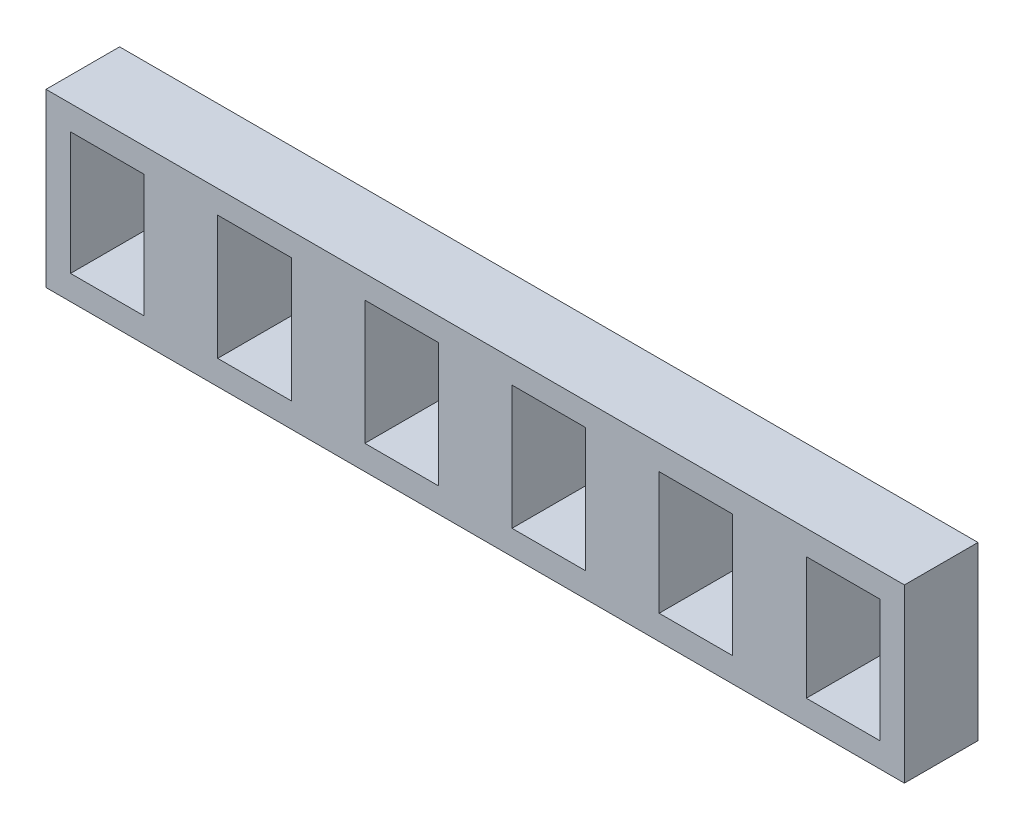
ISO-10303-21;
HEADER;
FILE_DESCRIPTION(('STEP AP214'),'2;1');
FILE_NAME('part.step','',(''),(''),'','','');
FILE_SCHEMA(('AUTOMOTIVE_DESIGN { 1 0 10303 214 1 1 1 1 }'));
ENDSEC;
DATA;
#1=APPLICATION_CONTEXT('core data for automotive mechanical design processes');
#2=APPLICATION_PROTOCOL_DEFINITION('international standard','automotive_design',2000,#1);
#3=PRODUCT_CONTEXT('',#1,'mechanical');
#4=PRODUCT('Part','Part','',(#3));
#5=PRODUCT_RELATED_PRODUCT_CATEGORY('part','',(#4));
#6=PRODUCT_DEFINITION_FORMATION('','',#4);
#7=PRODUCT_DEFINITION_CONTEXT('part definition',#1,'design');
#8=PRODUCT_DEFINITION('design','',#6,#7);
#9=PRODUCT_DEFINITION_SHAPE('','',#8);
#10=(LENGTH_UNIT() NAMED_UNIT(*) SI_UNIT(.MILLI.,.METRE.));
#11=(NAMED_UNIT(*) PLANE_ANGLE_UNIT() SI_UNIT($,.RADIAN.));
#12=(NAMED_UNIT(*) SI_UNIT($,.STERADIAN.) SOLID_ANGLE_UNIT());
#13=UNCERTAINTY_MEASURE_WITH_UNIT(LENGTH_MEASURE(1.E-05),#10,'distance_accuracy_value','');
#14=(GEOMETRIC_REPRESENTATION_CONTEXT(3) GLOBAL_UNCERTAINTY_ASSIGNED_CONTEXT((#13)) GLOBAL_UNIT_ASSIGNED_CONTEXT((#10,
#11,#12)) REPRESENTATION_CONTEXT('',''));
#15=CARTESIAN_POINT('',(0.,0.,0.));
#16=DIRECTION('',(0.,0.,1.));
#17=DIRECTION('',(1.,0.,0.));
#18=AXIS2_PLACEMENT_3D('',#15,#16,#17);
#19=CARTESIAN_POINT('',(0.,17.2786642532247,3.));
#20=DIRECTION('',(0.,1.,0.));
#21=DIRECTION('',(0.,0.,1.));
#22=AXIS2_PLACEMENT_3D('',#19,#20,#21);
#23=PLANE('',#22);
#24=DIRECTION('',(1.,0.,0.));
#25=VECTOR('',#24,1.);
#26=CARTESIAN_POINT('',(0.,17.2786642532247,0.));
#27=LINE('',#26,#25);
#28=CARTESIAN_POINT('',(-1.87785384637787,17.2786642532247,0.));
#29=VERTEX_POINT('',#28);
#30=CARTESIAN_POINT('',(1.12214615362213,17.2786642532247,0.));
#31=VERTEX_POINT('',#30);
#32=EDGE_CURVE('E361',#29,#31,#27,.T.);
#33=ORIENTED_EDGE('',*,*,#32,.T.);
#34=DIRECTION('',(0.,0.,-1.));
#35=VECTOR('',#34,1.);
#36=CARTESIAN_POINT('',(1.12214615362213,17.2786642532247,3.));
#37=LINE('',#36,#35);
#38=CARTESIAN_POINT('',(1.12214615362213,17.2786642532247,3.));
#39=VERTEX_POINT('',#38);
#40=EDGE_CURVE('E11',#39,#31,#37,.T.);
#41=ORIENTED_EDGE('',*,*,#40,.F.);
#42=DIRECTION('',(1.,0.,0.));
#43=VECTOR('',#42,1.);
#44=CARTESIAN_POINT('',(0.,17.2786642532247,3.));
#45=LINE('',#44,#43);
#46=CARTESIAN_POINT('',(-1.87785384637787,17.2786642532247,3.));
#47=VERTEX_POINT('',#46);
#48=EDGE_CURVE('E250',#47,#39,#45,.T.);
#49=ORIENTED_EDGE('',*,*,#48,.F.);
#50=DIRECTION('',(0.,0.,-1.));
#51=VECTOR('',#50,1.);
#52=CARTESIAN_POINT('',(-1.87785384637787,17.2786642532247,3.));
#53=LINE('',#52,#51);
#54=EDGE_CURVE('E70',#47,#29,#53,.T.);
#55=ORIENTED_EDGE('',*,*,#54,.T.);
#56=EDGE_LOOP('',(#33,#41,#49,#55));
#57=FACE_BOUND('',#56,.T.);
#58=ADVANCED_FACE('F50',(#57),#23,.F.);
#59=CARTESIAN_POINT('',(1.12214615362213,0.,3.));
#60=DIRECTION('',(1.,0.,0.));
#61=DIRECTION('',(0.,0.,-1.));
#62=AXIS2_PLACEMENT_3D('',#59,#60,#61);
#63=PLANE('',#62);
#64=DIRECTION('',(0.,-1.,0.));
#65=VECTOR('',#64,1.);
#66=CARTESIAN_POINT('',(1.12214615362213,0.,0.));
#67=LINE('',#66,#65);
#68=CARTESIAN_POINT('',(1.12214615362213,12.2206953629668,0.));
#69=VERTEX_POINT('',#68);
#70=EDGE_CURVE('E255',#31,#69,#67,.T.);
#71=ORIENTED_EDGE('',*,*,#70,.T.);
#72=DIRECTION('',(0.,0.,-1.));
#73=VECTOR('',#72,1.);
#74=CARTESIAN_POINT('',(1.12214615362213,12.2206953629668,3.));
#75=LINE('',#74,#73);
#76=CARTESIAN_POINT('',(1.12214615362213,12.2206953629668,3.));
#77=VERTEX_POINT('',#76);
#78=EDGE_CURVE('E59',#77,#69,#75,.T.);
#79=ORIENTED_EDGE('',*,*,#78,.F.);
#80=DIRECTION('',(0.,-1.,0.));
#81=VECTOR('',#80,1.);
#82=CARTESIAN_POINT('',(1.12214615362213,0.,3.));
#83=LINE('',#82,#81);
#84=EDGE_CURVE('E242',#39,#77,#83,.T.);
#85=ORIENTED_EDGE('',*,*,#84,.F.);
#86=ORIENTED_EDGE('',*,*,#40,.T.);
#87=EDGE_LOOP('',(#71,#79,#85,#86));
#88=FACE_BOUND('',#87,.T.);
#89=ADVANCED_FACE('F251',(#88),#63,.F.);
#90=CARTESIAN_POINT('',(0.,12.2206953629668,3.));
#91=DIRECTION('',(0.,1.,0.));
#92=DIRECTION('',(0.,0.,1.));
#93=AXIS2_PLACEMENT_3D('',#90,#91,#92);
#94=PLANE('',#93);
#95=DIRECTION('',(1.,0.,0.));
#96=VECTOR('',#95,1.);
#97=CARTESIAN_POINT('',(0.,12.2206953629668,0.));
#98=LINE('',#97,#96);
#99=CARTESIAN_POINT('',(-1.87785384637787,12.2206953629668,0.));
#100=VERTEX_POINT('',#99);
#101=EDGE_CURVE('E366',#100,#69,#98,.T.);
#102=ORIENTED_EDGE('',*,*,#101,.F.);
#103=DIRECTION('',(0.,0.,-1.));
#104=VECTOR('',#103,1.);
#105=CARTESIAN_POINT('',(-1.87785384637787,12.2206953629668,3.));
#106=LINE('',#105,#104);
#107=CARTESIAN_POINT('',(-1.87785384637787,12.2206953629668,3.));
#108=VERTEX_POINT('',#107);
#109=EDGE_CURVE('E153',#108,#100,#106,.T.);
#110=ORIENTED_EDGE('',*,*,#109,.F.);
#111=DIRECTION('',(1.,0.,0.));
#112=VECTOR('',#111,1.);
#113=CARTESIAN_POINT('',(0.,12.2206953629668,3.));
#114=LINE('',#113,#112);
#115=EDGE_CURVE('E247',#108,#77,#114,.T.);
#116=ORIENTED_EDGE('',*,*,#115,.T.);
#117=ORIENTED_EDGE('',*,*,#78,.T.);
#118=EDGE_LOOP('',(#102,#110,#116,#117));
#119=FACE_BOUND('',#118,.T.);
#120=ADVANCED_FACE('F259',(#119),#94,.T.);
#121=CARTESIAN_POINT('',(0.,17.2786642532247,3.));
#122=DIRECTION('',(0.,1.,0.));
#123=DIRECTION('',(0.,0.,1.));
#124=AXIS2_PLACEMENT_3D('',#121,#122,#123);
#125=PLANE('',#124);
#126=DIRECTION('',(1.,0.,0.));
#127=VECTOR('',#126,1.);
#128=CARTESIAN_POINT('',(0.,17.2786642532247,0.));
#129=LINE('',#128,#127);
#130=CARTESIAN_POINT('',(-7.87785384637787,17.2786642532247,0.));
#131=VERTEX_POINT('',#130);
#132=CARTESIAN_POINT('',(-4.87785384637787,17.2786642532247,0.));
#133=VERTEX_POINT('',#132);
#134=EDGE_CURVE('E350',#131,#133,#129,.T.);
#135=ORIENTED_EDGE('',*,*,#134,.T.);
#136=DIRECTION('',(0.,0.,-1.));
#137=VECTOR('',#136,1.);
#138=CARTESIAN_POINT('',(-4.87785384637787,17.2786642532247,3.));
#139=LINE('',#138,#137);
#140=CARTESIAN_POINT('',(-4.87785384637787,17.2786642532247,3.));
#141=VERTEX_POINT('',#140);
#142=EDGE_CURVE('E378',#141,#133,#139,.T.);
#143=ORIENTED_EDGE('',*,*,#142,.F.);
#144=DIRECTION('',(1.,0.,0.));
#145=VECTOR('',#144,1.);
#146=CARTESIAN_POINT('',(0.,17.2786642532247,3.));
#147=LINE('',#146,#145);
#148=CARTESIAN_POINT('',(-7.87785384637787,17.2786642532247,3.));
#149=VERTEX_POINT('',#148);
#150=EDGE_CURVE('E541',#149,#141,#147,.T.);
#151=ORIENTED_EDGE('',*,*,#150,.F.);
#152=DIRECTION('',(0.,0.,-1.));
#153=VECTOR('',#152,1.);
#154=CARTESIAN_POINT('',(-7.87785384637787,17.2786642532247,3.));
#155=LINE('',#154,#153);
#156=EDGE_CURVE('E381',#149,#131,#155,.T.);
#157=ORIENTED_EDGE('',*,*,#156,.T.);
#158=EDGE_LOOP('',(#135,#143,#151,#157));
#159=FACE_BOUND('',#158,.T.);
#160=ADVANCED_FACE('F575',(#159),#125,.F.);
#161=CARTESIAN_POINT('',(-4.87785384637787,0.,3.));
#162=DIRECTION('',(1.,0.,0.));
#163=DIRECTION('',(0.,0.,-1.));
#164=AXIS2_PLACEMENT_3D('',#161,#162,#163);
#165=PLANE('',#164);
#166=DIRECTION('',(0.,-1.,0.));
#167=VECTOR('',#166,1.);
#168=CARTESIAN_POINT('',(-4.87785384637787,0.,0.));
#169=LINE('',#168,#167);
#170=CARTESIAN_POINT('',(-4.87785384637787,12.2206953629668,0.));
#171=VERTEX_POINT('',#170);
#172=EDGE_CURVE('E352',#133,#171,#169,.T.);
#173=ORIENTED_EDGE('',*,*,#172,.T.);
#174=DIRECTION('',(0.,0.,-1.));
#175=VECTOR('',#174,1.);
#176=CARTESIAN_POINT('',(-4.87785384637787,12.2206953629668,3.));
#177=LINE('',#176,#175);
#178=CARTESIAN_POINT('',(-4.87785384637787,12.2206953629668,3.));
#179=VERTEX_POINT('',#178);
#180=EDGE_CURVE('E389',#179,#171,#177,.T.);
#181=ORIENTED_EDGE('',*,*,#180,.F.);
#182=DIRECTION('',(0.,-1.,0.));
#183=VECTOR('',#182,1.);
#184=CARTESIAN_POINT('',(-4.87785384637787,0.,3.));
#185=LINE('',#184,#183);
#186=EDGE_CURVE('E544',#141,#179,#185,.T.);
#187=ORIENTED_EDGE('',*,*,#186,.F.);
#188=ORIENTED_EDGE('',*,*,#142,.T.);
#189=EDGE_LOOP('',(#173,#181,#187,#188));
#190=FACE_BOUND('',#189,.T.);
#191=ADVANCED_FACE('F571',(#190),#165,.F.);
#192=CARTESIAN_POINT('',(0.,12.2206953629668,3.));
#193=DIRECTION('',(0.,1.,0.));
#194=DIRECTION('',(0.,0.,1.));
#195=AXIS2_PLACEMENT_3D('',#192,#193,#194);
#196=PLANE('',#195);
#197=DIRECTION('',(1.,0.,0.));
#198=VECTOR('',#197,1.);
#199=CARTESIAN_POINT('',(0.,12.2206953629668,0.));
#200=LINE('',#199,#198);
#201=CARTESIAN_POINT('',(-7.87785384637787,12.2206953629668,0.));
#202=VERTEX_POINT('',#201);
#203=EDGE_CURVE('E353',#202,#171,#200,.T.);
#204=ORIENTED_EDGE('',*,*,#203,.F.);
#205=DIRECTION('',(0.,0.,-1.));
#206=VECTOR('',#205,1.);
#207=CARTESIAN_POINT('',(-7.87785384637787,12.2206953629668,3.));
#208=LINE('',#207,#206);
#209=CARTESIAN_POINT('',(-7.87785384637787,12.2206953629668,3.));
#210=VERTEX_POINT('',#209);
#211=EDGE_CURVE('E383',#210,#202,#208,.T.);
#212=ORIENTED_EDGE('',*,*,#211,.F.);
#213=DIRECTION('',(1.,0.,0.));
#214=VECTOR('',#213,1.);
#215=CARTESIAN_POINT('',(0.,12.2206953629668,3.));
#216=LINE('',#215,#214);
#217=EDGE_CURVE('E547',#210,#179,#216,.T.);
#218=ORIENTED_EDGE('',*,*,#217,.T.);
#219=ORIENTED_EDGE('',*,*,#180,.T.);
#220=EDGE_LOOP('',(#204,#212,#218,#219));
#221=FACE_BOUND('',#220,.T.);
#222=ADVANCED_FACE('F570',(#221),#196,.T.);
#223=CARTESIAN_POINT('',(0.,17.2786642532247,3.));
#224=DIRECTION('',(0.,1.,0.));
#225=DIRECTION('',(0.,0.,1.));
#226=AXIS2_PLACEMENT_3D('',#223,#224,#225);
#227=PLANE('',#226);
#228=DIRECTION('',(1.,0.,0.));
#229=VECTOR('',#228,1.);
#230=CARTESIAN_POINT('',(0.,17.2786642532247,0.));
#231=LINE('',#230,#229);
#232=CARTESIAN_POINT('',(-13.8778538463779,17.2786642532247,0.));
#233=VERTEX_POINT('',#232);
#234=CARTESIAN_POINT('',(-10.8778538463779,17.2786642532247,0.));
#235=VERTEX_POINT('',#234);
#236=EDGE_CURVE('E332',#233,#235,#231,.T.);
#237=ORIENTED_EDGE('',*,*,#236,.T.);
#238=DIRECTION('',(0.,0.,-1.));
#239=VECTOR('',#238,1.);
#240=CARTESIAN_POINT('',(-10.8778538463779,17.2786642532247,3.));
#241=LINE('',#240,#239);
#242=CARTESIAN_POINT('',(-10.8778538463779,17.2786642532247,3.));
#243=VERTEX_POINT('',#242);
#244=EDGE_CURVE('E384',#243,#235,#241,.T.);
#245=ORIENTED_EDGE('',*,*,#244,.F.);
#246=DIRECTION('',(1.,0.,0.));
#247=VECTOR('',#246,1.);
#248=CARTESIAN_POINT('',(0.,17.2786642532247,3.));
#249=LINE('',#248,#247);
#250=CARTESIAN_POINT('',(-13.8778538463779,17.2786642532247,3.));
#251=VERTEX_POINT('',#250);
#252=EDGE_CURVE('E528',#251,#243,#249,.T.);
#253=ORIENTED_EDGE('',*,*,#252,.F.);
#254=DIRECTION('',(0.,0.,-1.));
#255=VECTOR('',#254,1.);
#256=CARTESIAN_POINT('',(-13.8778538463779,17.2786642532247,3.));
#257=LINE('',#256,#255);
#258=EDGE_CURVE('E391',#251,#233,#257,.T.);
#259=ORIENTED_EDGE('',*,*,#258,.T.);
#260=EDGE_LOOP('',(#237,#245,#253,#259));
#261=FACE_BOUND('',#260,.T.);
#262=ADVANCED_FACE('F583',(#261),#227,.F.);
#263=CARTESIAN_POINT('',(-10.8778538463779,0.,3.));
#264=DIRECTION('',(1.,0.,0.));
#265=DIRECTION('',(0.,0.,-1.));
#266=AXIS2_PLACEMENT_3D('',#263,#264,#265);
#267=PLANE('',#266);
#268=DIRECTION('',(0.,-1.,0.));
#269=VECTOR('',#268,1.);
#270=CARTESIAN_POINT('',(-10.8778538463779,0.,0.));
#271=LINE('',#270,#269);
#272=CARTESIAN_POINT('',(-10.8778538463779,12.2206953629668,0.));
#273=VERTEX_POINT('',#272);
#274=EDGE_CURVE('E333',#235,#273,#271,.T.);
#275=ORIENTED_EDGE('',*,*,#274,.T.);
#276=DIRECTION('',(0.,0.,-1.));
#277=VECTOR('',#276,1.);
#278=CARTESIAN_POINT('',(-10.8778538463779,12.2206953629668,3.));
#279=LINE('',#278,#277);
#280=CARTESIAN_POINT('',(-10.8778538463779,12.2206953629668,3.));
#281=VERTEX_POINT('',#280);
#282=EDGE_CURVE('E402',#281,#273,#279,.T.);
#283=ORIENTED_EDGE('',*,*,#282,.F.);
#284=DIRECTION('',(0.,-1.,0.));
#285=VECTOR('',#284,1.);
#286=CARTESIAN_POINT('',(-10.8778538463779,0.,3.));
#287=LINE('',#286,#285);
#288=EDGE_CURVE('E529',#243,#281,#287,.T.);
#289=ORIENTED_EDGE('',*,*,#288,.F.);
#290=ORIENTED_EDGE('',*,*,#244,.T.);
#291=EDGE_LOOP('',(#275,#283,#289,#290));
#292=FACE_BOUND('',#291,.T.);
#293=ADVANCED_FACE('F658',(#292),#267,.F.);
#294=CARTESIAN_POINT('',(0.,12.2206953629668,3.));
#295=DIRECTION('',(0.,1.,0.));
#296=DIRECTION('',(0.,0.,1.));
#297=AXIS2_PLACEMENT_3D('',#294,#295,#296);
#298=PLANE('',#297);
#299=DIRECTION('',(1.,0.,0.));
#300=VECTOR('',#299,1.);
#301=CARTESIAN_POINT('',(0.,12.2206953629668,0.));
#302=LINE('',#301,#300);
#303=CARTESIAN_POINT('',(-13.8778538463779,12.2206953629668,0.));
#304=VERTEX_POINT('',#303);
#305=EDGE_CURVE('E336',#304,#273,#302,.T.);
#306=ORIENTED_EDGE('',*,*,#305,.F.);
#307=DIRECTION('',(0.,0.,-1.));
#308=VECTOR('',#307,1.);
#309=CARTESIAN_POINT('',(-13.8778538463779,12.2206953629668,3.));
#310=LINE('',#309,#308);
#311=CARTESIAN_POINT('',(-13.8778538463779,12.2206953629668,3.));
#312=VERTEX_POINT('',#311);
#313=EDGE_CURVE('E400',#312,#304,#310,.T.);
#314=ORIENTED_EDGE('',*,*,#313,.F.);
#315=DIRECTION('',(1.,0.,0.));
#316=VECTOR('',#315,1.);
#317=CARTESIAN_POINT('',(0.,12.2206953629668,3.));
#318=LINE('',#317,#316);
#319=EDGE_CURVE('E531',#312,#281,#318,.T.);
#320=ORIENTED_EDGE('',*,*,#319,.T.);
#321=ORIENTED_EDGE('',*,*,#282,.T.);
#322=EDGE_LOOP('',(#306,#314,#320,#321));
#323=FACE_BOUND('',#322,.T.);
#324=ADVANCED_FACE('F646',(#323),#298,.T.);
#325=CARTESIAN_POINT('',(0.,17.2206953629667,3.));
#326=DIRECTION('',(0.,-1.,0.));
#327=DIRECTION('',(1.,0.,0.));
#328=AXIS2_PLACEMENT_3D('',#325,#326,#327);
#329=PLANE('',#328);
#330=DIRECTION('',(-1.,0.,0.));
#331=VECTOR('',#330,1.);
#332=CARTESIAN_POINT('',(0.,17.2206953629667,0.));
#333=LINE('',#332,#331);
#334=CARTESIAN_POINT('',(13.1221461536221,17.2206953629668,0.));
#335=VERTEX_POINT('',#334);
#336=CARTESIAN_POINT('',(10.1221461536221,17.2206953629668,0.));
#337=VERTEX_POINT('',#336);
#338=EDGE_CURVE('E312',#335,#337,#333,.T.);
#339=ORIENTED_EDGE('',*,*,#338,.F.);
#340=DIRECTION('',(0.,0.,-1.));
#341=VECTOR('',#340,1.);
#342=CARTESIAN_POINT('',(13.1221461536221,17.2206953629668,3.));
#343=LINE('',#342,#341);
#344=CARTESIAN_POINT('',(13.1221461536221,17.2206953629668,3.));
#345=VERTEX_POINT('',#344);
#346=EDGE_CURVE('E399',#345,#335,#343,.T.);
#347=ORIENTED_EDGE('',*,*,#346,.F.);
#348=DIRECTION('',(-1.,0.,0.));
#349=VECTOR('',#348,1.);
#350=CARTESIAN_POINT('',(0.,17.2206953629667,3.));
#351=LINE('',#350,#349);
#352=CARTESIAN_POINT('',(10.1221461536221,17.2206953629668,3.));
#353=VERTEX_POINT('',#352);
#354=EDGE_CURVE('E512',#345,#353,#351,.T.);
#355=ORIENTED_EDGE('',*,*,#354,.T.);
#356=DIRECTION('',(0.,0.,-1.));
#357=VECTOR('',#356,1.);
#358=CARTESIAN_POINT('',(10.1221461536221,17.2206953629668,3.));
#359=LINE('',#358,#357);
#360=EDGE_CURVE('E410',#353,#337,#359,.T.);
#361=ORIENTED_EDGE('',*,*,#360,.T.);
#362=EDGE_LOOP('',(#339,#347,#355,#361));
#363=FACE_BOUND('',#362,.T.);
#364=ADVANCED_FACE('F645',(#363),#329,.T.);
#365=CARTESIAN_POINT('',(13.1221461536221,0.,3.));
#366=DIRECTION('',(1.,0.,0.));
#367=DIRECTION('',(0.,0.,-1.));
#368=AXIS2_PLACEMENT_3D('',#365,#366,#367);
#369=PLANE('',#368);
#370=DIRECTION('',(0.,-1.,0.));
#371=VECTOR('',#370,1.);
#372=CARTESIAN_POINT('',(13.1221461536221,0.,0.));
#373=LINE('',#372,#371);
#374=CARTESIAN_POINT('',(13.1221461536221,12.2206953629668,0.));
#375=VERTEX_POINT('',#374);
#376=EDGE_CURVE('E317',#335,#375,#373,.T.);
#377=ORIENTED_EDGE('',*,*,#376,.T.);
#378=DIRECTION('',(0.,0.,-1.));
#379=VECTOR('',#378,1.);
#380=CARTESIAN_POINT('',(13.1221461536221,12.2206953629668,3.));
#381=LINE('',#380,#379);
#382=CARTESIAN_POINT('',(13.1221461536221,12.2206953629668,3.));
#383=VERTEX_POINT('',#382);
#384=EDGE_CURVE('E411',#383,#375,#381,.T.);
#385=ORIENTED_EDGE('',*,*,#384,.F.);
#386=DIRECTION('',(0.,-1.,0.));
#387=VECTOR('',#386,1.);
#388=CARTESIAN_POINT('',(13.1221461536221,0.,3.));
#389=LINE('',#388,#387);
#390=EDGE_CURVE('E513',#345,#383,#389,.T.);
#391=ORIENTED_EDGE('',*,*,#390,.F.);
#392=ORIENTED_EDGE('',*,*,#346,.T.);
#393=EDGE_LOOP('',(#377,#385,#391,#392));
#394=FACE_BOUND('',#393,.T.);
#395=ADVANCED_FACE('F642',(#394),#369,.F.);
#396=CARTESIAN_POINT('',(0.,12.2206953629668,3.));
#397=DIRECTION('',(0.,-1.,0.));
#398=DIRECTION('',(0.,0.,-1.));
#399=AXIS2_PLACEMENT_3D('',#396,#397,#398);
#400=PLANE('',#399);
#401=DIRECTION('',(-1.,0.,0.));
#402=VECTOR('',#401,1.);
#403=CARTESIAN_POINT('',(0.,12.2206953629668,0.));
#404=LINE('',#403,#402);
#405=CARTESIAN_POINT('',(10.1221461536221,12.2206953629668,0.));
#406=VERTEX_POINT('',#405);
#407=EDGE_CURVE('E323',#375,#406,#404,.T.);
#408=ORIENTED_EDGE('',*,*,#407,.T.);
#409=DIRECTION('',(0.,0.,-1.));
#410=VECTOR('',#409,1.);
#411=CARTESIAN_POINT('',(10.1221461536221,12.2206953629668,3.));
#412=LINE('',#411,#410);
#413=CARTESIAN_POINT('',(10.1221461536221,12.2206953629668,3.));
#414=VERTEX_POINT('',#413);
#415=EDGE_CURVE('E408',#414,#406,#412,.T.);
#416=ORIENTED_EDGE('',*,*,#415,.F.);
#417=DIRECTION('',(-1.,0.,0.));
#418=VECTOR('',#417,1.);
#419=CARTESIAN_POINT('',(0.,12.2206953629668,3.));
#420=LINE('',#419,#418);
#421=EDGE_CURVE('E516',#383,#414,#420,.T.);
#422=ORIENTED_EDGE('',*,*,#421,.F.);
#423=ORIENTED_EDGE('',*,*,#384,.T.);
#424=EDGE_LOOP('',(#408,#416,#422,#423));
#425=FACE_BOUND('',#424,.T.);
#426=ADVANCED_FACE('F632',(#425),#400,.F.);
#427=CARTESIAN_POINT('',(0.,17.2206953629667,3.));
#428=DIRECTION('',(0.,1.,0.));
#429=DIRECTION('',(-1.,0.,0.));
#430=AXIS2_PLACEMENT_3D('',#427,#428,#429);
#431=PLANE('',#430);
#432=DIRECTION('',(1.,0.,0.));
#433=VECTOR('',#432,1.);
#434=CARTESIAN_POINT('',(0.,17.2206953629667,0.));
#435=LINE('',#434,#433);
#436=CARTESIAN_POINT('',(-19.8778538463779,17.2206953629668,0.));
#437=VERTEX_POINT('',#436);
#438=CARTESIAN_POINT('',(-16.8778538463779,17.2206953629668,0.));
#439=VERTEX_POINT('',#438);
#440=EDGE_CURVE('E296',#437,#439,#435,.T.);
#441=ORIENTED_EDGE('',*,*,#440,.T.);
#442=DIRECTION('',(0.,0.,-1.));
#443=VECTOR('',#442,1.);
#444=CARTESIAN_POINT('',(-16.8778538463779,17.2206953629668,3.));
#445=LINE('',#444,#443);
#446=CARTESIAN_POINT('',(-16.8778538463779,17.2206953629668,3.));
#447=VERTEX_POINT('',#446);
#448=EDGE_CURVE('E412',#447,#439,#445,.T.);
#449=ORIENTED_EDGE('',*,*,#448,.F.);
#450=DIRECTION('',(1.,0.,0.));
#451=VECTOR('',#450,1.);
#452=CARTESIAN_POINT('',(0.,17.2206953629667,3.));
#453=LINE('',#452,#451);
#454=CARTESIAN_POINT('',(-19.8778538463779,17.2206953629668,3.));
#455=VERTEX_POINT('',#454);
#456=EDGE_CURVE('E497',#455,#447,#453,.T.);
#457=ORIENTED_EDGE('',*,*,#456,.F.);
#458=DIRECTION('',(0.,0.,-1.));
#459=VECTOR('',#458,1.);
#460=CARTESIAN_POINT('',(-19.8778538463779,17.2206953629668,3.));
#461=LINE('',#460,#459);
#462=EDGE_CURVE('E419',#455,#437,#461,.T.);
#463=ORIENTED_EDGE('',*,*,#462,.T.);
#464=EDGE_LOOP('',(#441,#449,#457,#463));
#465=FACE_BOUND('',#464,.T.);
#466=ADVANCED_FACE('F630',(#465),#431,.F.);
#467=CARTESIAN_POINT('',(-16.8778538463779,0.,3.));
#468=DIRECTION('',(1.,0.,0.));
#469=DIRECTION('',(0.,0.,-1.));
#470=AXIS2_PLACEMENT_3D('',#467,#468,#469);
#471=PLANE('',#470);
#472=DIRECTION('',(0.,-1.,0.));
#473=VECTOR('',#472,1.);
#474=CARTESIAN_POINT('',(-16.8778538463779,0.,0.));
#475=LINE('',#474,#473);
#476=CARTESIAN_POINT('',(-16.8778538463779,12.2206953629668,0.));
#477=VERTEX_POINT('',#476);
#478=EDGE_CURVE('E304',#439,#477,#475,.T.);
#479=ORIENTED_EDGE('',*,*,#478,.T.);
#480=DIRECTION('',(0.,0.,-1.));
#481=VECTOR('',#480,1.);
#482=CARTESIAN_POINT('',(-16.8778538463779,12.2206953629668,3.));
#483=LINE('',#482,#481);
#484=CARTESIAN_POINT('',(-16.8778538463779,12.2206953629668,3.));
#485=VERTEX_POINT('',#484);
#486=EDGE_CURVE('E430',#485,#477,#483,.T.);
#487=ORIENTED_EDGE('',*,*,#486,.F.);
#488=DIRECTION('',(0.,-1.,0.));
#489=VECTOR('',#488,1.);
#490=CARTESIAN_POINT('',(-16.8778538463779,0.,3.));
#491=LINE('',#490,#489);
#492=EDGE_CURVE('E498',#447,#485,#491,.T.);
#493=ORIENTED_EDGE('',*,*,#492,.F.);
#494=ORIENTED_EDGE('',*,*,#448,.T.);
#495=EDGE_LOOP('',(#479,#487,#493,#494));
#496=FACE_BOUND('',#495,.T.);
#497=ADVANCED_FACE('F628',(#496),#471,.F.);
#498=CARTESIAN_POINT('',(0.,12.2206953629668,3.));
#499=DIRECTION('',(0.,1.,0.));
#500=DIRECTION('',(0.,0.,1.));
#501=AXIS2_PLACEMENT_3D('',#498,#499,#500);
#502=PLANE('',#501);
#503=DIRECTION('',(1.,0.,0.));
#504=VECTOR('',#503,1.);
#505=CARTESIAN_POINT('',(0.,12.2206953629668,0.));
#506=LINE('',#505,#504);
#507=CARTESIAN_POINT('',(-19.8778538463779,12.2206953629668,0.));
#508=VERTEX_POINT('',#507);
#509=EDGE_CURVE('E307',#508,#477,#506,.T.);
#510=ORIENTED_EDGE('',*,*,#509,.F.);
#511=DIRECTION('',(0.,0.,-1.));
#512=VECTOR('',#511,1.);
#513=CARTESIAN_POINT('',(-19.8778538463779,12.2206953629668,3.));
#514=LINE('',#513,#512);
#515=CARTESIAN_POINT('',(-19.8778538463779,12.2206953629668,3.));
#516=VERTEX_POINT('',#515);
#517=EDGE_CURVE('E421',#516,#508,#514,.T.);
#518=ORIENTED_EDGE('',*,*,#517,.F.);
#519=DIRECTION('',(1.,0.,0.));
#520=VECTOR('',#519,1.);
#521=CARTESIAN_POINT('',(0.,12.2206953629668,3.));
#522=LINE('',#521,#520);
#523=EDGE_CURVE('E504',#516,#485,#522,.T.);
#524=ORIENTED_EDGE('',*,*,#523,.T.);
#525=ORIENTED_EDGE('',*,*,#486,.T.);
#526=EDGE_LOOP('',(#510,#518,#524,#525));
#527=FACE_BOUND('',#526,.T.);
#528=ADVANCED_FACE('F611',(#527),#502,.T.);
#529=CARTESIAN_POINT('',(14.1221461536221,0.,3.));
#530=DIRECTION('',(1.,0.,0.));
#531=DIRECTION('',(0.,0.,-1.));
#532=AXIS2_PLACEMENT_3D('',#529,#530,#531);
#533=PLANE('',#532);
#534=DIRECTION('',(0.,-1.,0.));
#535=VECTOR('',#534,1.);
#536=CARTESIAN_POINT('',(14.1221461536221,0.,0.));
#537=LINE('',#536,#535);
#538=CARTESIAN_POINT('',(14.1221461536221,18.2211957613396,0.));
#539=VERTEX_POINT('',#538);
#540=CARTESIAN_POINT('',(14.1221461536221,11.2211957613396,0.));
#541=VERTEX_POINT('',#540);
#542=EDGE_CURVE('E284',#539,#541,#537,.T.);
#543=ORIENTED_EDGE('',*,*,#542,.F.);
#544=DIRECTION('',(0.,0.,-1.));
#545=VECTOR('',#544,1.);
#546=CARTESIAN_POINT('',(14.1221461536221,18.2211957613396,3.));
#547=LINE('',#546,#545);
#548=CARTESIAN_POINT('',(14.1221461536221,18.2211957613396,3.));
#549=VERTEX_POINT('',#548);
#550=EDGE_CURVE('E424',#549,#539,#547,.T.);
#551=ORIENTED_EDGE('',*,*,#550,.F.);
#552=DIRECTION('',(0.,-1.,0.));
#553=VECTOR('',#552,1.);
#554=CARTESIAN_POINT('',(14.1221461536221,0.,3.));
#555=LINE('',#554,#553);
#556=CARTESIAN_POINT('',(14.1221461536221,11.2211957613396,3.));
#557=VERTEX_POINT('',#556);
#558=EDGE_CURVE('E474',#549,#557,#555,.T.);
#559=ORIENTED_EDGE('',*,*,#558,.T.);
#560=DIRECTION('',(0.,0.,-1.));
#561=VECTOR('',#560,1.);
#562=CARTESIAN_POINT('',(14.1221461536221,11.2211957613396,3.));
#563=LINE('',#562,#561);
#564=EDGE_CURVE('E433',#557,#541,#563,.T.);
#565=ORIENTED_EDGE('',*,*,#564,.T.);
#566=EDGE_LOOP('',(#543,#551,#559,#565));
#567=FACE_BOUND('',#566,.T.);
#568=ADVANCED_FACE('F608',(#567),#533,.T.);
#569=CARTESIAN_POINT('',(0.,18.2211957613396,3.));
#570=DIRECTION('',(0.,1.,0.));
#571=DIRECTION('',(0.,0.,1.));
#572=AXIS2_PLACEMENT_3D('',#569,#570,#571);
#573=PLANE('',#572);
#574=DIRECTION('',(1.,0.,0.));
#575=VECTOR('',#574,1.);
#576=CARTESIAN_POINT('',(0.,18.2211957613396,0.));
#577=LINE('',#576,#575);
#578=CARTESIAN_POINT('',(-20.8778538463779,18.2211957613396,0.));
#579=VERTEX_POINT('',#578);
#580=EDGE_CURVE('E290',#579,#539,#577,.T.);
#581=ORIENTED_EDGE('',*,*,#580,.F.);
#582=DIRECTION('',(0.,0.,-1.));
#583=VECTOR('',#582,1.);
#584=CARTESIAN_POINT('',(-20.8778538463779,18.2211957613396,3.));
#585=LINE('',#584,#583);
#586=CARTESIAN_POINT('',(-20.8778538463779,18.2211957613396,3.));
#587=VERTEX_POINT('',#586);
#588=EDGE_CURVE('E439',#587,#579,#585,.T.);
#589=ORIENTED_EDGE('',*,*,#588,.F.);
#590=DIRECTION('',(1.,0.,0.));
#591=VECTOR('',#590,1.);
#592=CARTESIAN_POINT('',(0.,18.2211957613396,3.));
#593=LINE('',#592,#591);
#594=EDGE_CURVE('E481',#587,#549,#593,.T.);
#595=ORIENTED_EDGE('',*,*,#594,.T.);
#596=ORIENTED_EDGE('',*,*,#550,.T.);
#597=EDGE_LOOP('',(#581,#589,#595,#596));
#598=FACE_BOUND('',#597,.T.);
#599=ADVANCED_FACE('F614',(#598),#573,.T.);
#600=CARTESIAN_POINT('',(-20.8778538463779,0.,3.));
#601=DIRECTION('',(1.,0.,0.));
#602=DIRECTION('',(0.,0.,-1.));
#603=AXIS2_PLACEMENT_3D('',#600,#601,#602);
#604=PLANE('',#603);
#605=DIRECTION('',(0.,-1.,0.));
#606=VECTOR('',#605,1.);
#607=CARTESIAN_POINT('',(-20.8778538463779,0.,0.));
#608=LINE('',#607,#606);
#609=CARTESIAN_POINT('',(-20.8778538463779,11.2211957613396,0.));
#610=VERTEX_POINT('',#609);
#611=EDGE_CURVE('E292',#579,#610,#608,.T.);
#612=ORIENTED_EDGE('',*,*,#611,.T.);
#613=DIRECTION('',(0.,0.,-1.));
#614=VECTOR('',#613,1.);
#615=CARTESIAN_POINT('',(-20.8778538463779,11.2211957613396,3.));
#616=LINE('',#615,#614);
#617=CARTESIAN_POINT('',(-20.8778538463779,11.2211957613396,3.));
#618=VERTEX_POINT('',#617);
#619=EDGE_CURVE('E436',#618,#610,#616,.T.);
#620=ORIENTED_EDGE('',*,*,#619,.F.);
#621=DIRECTION('',(0.,-1.,0.));
#622=VECTOR('',#621,1.);
#623=CARTESIAN_POINT('',(-20.8778538463779,0.,3.));
#624=LINE('',#623,#622);
#625=EDGE_CURVE('E487',#587,#618,#624,.T.);
#626=ORIENTED_EDGE('',*,*,#625,.F.);
#627=ORIENTED_EDGE('',*,*,#588,.T.);
#628=EDGE_LOOP('',(#612,#620,#626,#627));
#629=FACE_BOUND('',#628,.T.);
#630=ADVANCED_FACE('F619',(#629),#604,.F.);
#631=CARTESIAN_POINT('',(4.12214615362213,0.,3.));
#632=DIRECTION('',(1.,0.,0.));
#633=DIRECTION('',(0.,0.,-1.));
#634=AXIS2_PLACEMENT_3D('',#631,#632,#633);
#635=PLANE('',#634);
#636=DIRECTION('',(0.,-1.,0.));
#637=VECTOR('',#636,1.);
#638=CARTESIAN_POINT('',(4.12214615362213,0.,0.));
#639=LINE('',#638,#637);
#640=CARTESIAN_POINT('',(4.12214615362213,17.2206953629668,0.));
#641=VERTEX_POINT('',#640);
#642=CARTESIAN_POINT('',(4.12214615362213,12.2206953629668,0.));
#643=VERTEX_POINT('',#642);
#644=EDGE_CURVE('E268',#641,#643,#639,.T.);
#645=ORIENTED_EDGE('',*,*,#644,.F.);
#646=DIRECTION('',(0.,0.,-1.));
#647=VECTOR('',#646,1.);
#648=CARTESIAN_POINT('',(4.12214615362213,17.2206953629668,3.));
#649=LINE('',#648,#647);
#650=CARTESIAN_POINT('',(4.12214615362213,17.2206953629668,3.));
#651=VERTEX_POINT('',#650);
#652=EDGE_CURVE('E51',#651,#641,#649,.T.);
#653=ORIENTED_EDGE('',*,*,#652,.F.);
#654=DIRECTION('',(0.,-1.,0.));
#655=VECTOR('',#654,1.);
#656=CARTESIAN_POINT('',(4.12214615362213,0.,3.));
#657=LINE('',#656,#655);
#658=CARTESIAN_POINT('',(4.12214615362213,12.2206953629668,3.));
#659=VERTEX_POINT('',#658);
#660=EDGE_CURVE('E374',#651,#659,#657,.T.);
#661=ORIENTED_EDGE('',*,*,#660,.T.);
#662=DIRECTION('',(0.,0.,-1.));
#663=VECTOR('',#662,1.);
#664=CARTESIAN_POINT('',(4.12214615362213,12.2206953629668,3.));
#665=LINE('',#664,#663);
#666=EDGE_CURVE('E262',#659,#643,#665,.T.);
#667=ORIENTED_EDGE('',*,*,#666,.T.);
#668=EDGE_LOOP('',(#645,#653,#661,#667));
#669=FACE_BOUND('',#668,.T.);
#670=ADVANCED_FACE('F47',(#669),#635,.T.);
#671=CARTESIAN_POINT('',(0.,17.2206953629668,3.));
#672=DIRECTION('',(0.,-1.,0.));
#673=DIRECTION('',(0.,0.,-1.));
#674=AXIS2_PLACEMENT_3D('',#671,#672,#673);
#675=PLANE('',#674);
#676=DIRECTION('',(-1.,0.,0.));
#677=VECTOR('',#676,1.);
#678=CARTESIAN_POINT('',(0.,17.2206953629668,0.));
#679=LINE('',#678,#677);
#680=CARTESIAN_POINT('',(7.12214615362213,17.2206953629668,0.));
#681=VERTEX_POINT('',#680);
#682=EDGE_CURVE('E275',#681,#641,#679,.T.);
#683=ORIENTED_EDGE('',*,*,#682,.F.);
#684=DIRECTION('',(0.,0.,-1.));
#685=VECTOR('',#684,1.);
#686=CARTESIAN_POINT('',(7.12214615362213,17.2206953629668,3.));
#687=LINE('',#686,#685);
#688=CARTESIAN_POINT('',(7.12214615362213,17.2206953629668,3.));
#689=VERTEX_POINT('',#688);
#690=EDGE_CURVE('E448',#689,#681,#687,.T.);
#691=ORIENTED_EDGE('',*,*,#690,.F.);
#692=DIRECTION('',(-1.,0.,0.));
#693=VECTOR('',#692,1.);
#694=CARTESIAN_POINT('',(0.,17.2206953629668,3.));
#695=LINE('',#694,#693);
#696=EDGE_CURVE('E462',#689,#651,#695,.T.);
#697=ORIENTED_EDGE('',*,*,#696,.T.);
#698=ORIENTED_EDGE('',*,*,#652,.T.);
#699=EDGE_LOOP('',(#683,#691,#697,#698));
#700=FACE_BOUND('',#699,.T.);
#701=ADVANCED_FACE('F459',(#700),#675,.T.);
#702=CARTESIAN_POINT('',(7.12214615362213,0.,3.));
#703=DIRECTION('',(1.,0.,0.));
#704=DIRECTION('',(0.,0.,-1.));
#705=AXIS2_PLACEMENT_3D('',#702,#703,#704);
#706=PLANE('',#705);
#707=DIRECTION('',(0.,-1.,0.));
#708=VECTOR('',#707,1.);
#709=CARTESIAN_POINT('',(7.12214615362213,0.,0.));
#710=LINE('',#709,#708);
#711=CARTESIAN_POINT('',(7.12214615362213,12.2206953629668,0.));
#712=VERTEX_POINT('',#711);
#713=EDGE_CURVE('E277',#681,#712,#710,.T.);
#714=ORIENTED_EDGE('',*,*,#713,.T.);
#715=DIRECTION('',(0.,0.,-1.));
#716=VECTOR('',#715,1.);
#717=CARTESIAN_POINT('',(7.12214615362213,12.2206953629668,3.));
#718=LINE('',#717,#716);
#719=CARTESIAN_POINT('',(7.12214615362213,12.2206953629668,3.));
#720=VERTEX_POINT('',#719);
#721=EDGE_CURVE('E450',#720,#712,#718,.T.);
#722=ORIENTED_EDGE('',*,*,#721,.F.);
#723=DIRECTION('',(0.,-1.,0.));
#724=VECTOR('',#723,1.);
#725=CARTESIAN_POINT('',(7.12214615362213,0.,3.));
#726=LINE('',#725,#724);
#727=EDGE_CURVE('E478',#689,#720,#726,.T.);
#728=ORIENTED_EDGE('',*,*,#727,.F.);
#729=ORIENTED_EDGE('',*,*,#690,.T.);
#730=EDGE_LOOP('',(#714,#722,#728,#729));
#731=FACE_BOUND('',#730,.T.);
#732=ADVANCED_FACE('F469',(#731),#706,.F.);
#733=CARTESIAN_POINT('',(-7.87785384637787,0.,3.));
#734=DIRECTION('',(1.,0.,0.));
#735=DIRECTION('',(0.,0.,-1.));
#736=AXIS2_PLACEMENT_3D('',#733,#734,#735);
#737=PLANE('',#736);
#738=DIRECTION('',(0.,-1.,0.));
#739=VECTOR('',#738,1.);
#740=CARTESIAN_POINT('',(-7.87785384637787,0.,0.));
#741=LINE('',#740,#739);
#742=EDGE_CURVE('E356',#131,#202,#741,.T.);
#743=ORIENTED_EDGE('',*,*,#742,.F.);
#744=ORIENTED_EDGE('',*,*,#156,.F.);
#745=DIRECTION('',(0.,-1.,0.));
#746=VECTOR('',#745,1.);
#747=CARTESIAN_POINT('',(-7.87785384637787,0.,3.));
#748=LINE('',#747,#746);
#749=EDGE_CURVE('E555',#149,#210,#748,.T.);
#750=ORIENTED_EDGE('',*,*,#749,.T.);
#751=ORIENTED_EDGE('',*,*,#211,.T.);
#752=EDGE_LOOP('',(#743,#744,#750,#751));
#753=FACE_BOUND('',#752,.T.);
#754=ADVANCED_FACE('F556',(#753),#737,.T.);
#755=CARTESIAN_POINT('',(-13.8778538463779,0.,3.));
#756=DIRECTION('',(1.,0.,0.));
#757=DIRECTION('',(0.,0.,-1.));
#758=AXIS2_PLACEMENT_3D('',#755,#756,#757);
#759=PLANE('',#758);
#760=DIRECTION('',(0.,-1.,0.));
#761=VECTOR('',#760,1.);
#762=CARTESIAN_POINT('',(-13.8778538463779,0.,0.));
#763=LINE('',#762,#761);
#764=EDGE_CURVE('E344',#233,#304,#763,.T.);
#765=ORIENTED_EDGE('',*,*,#764,.F.);
#766=ORIENTED_EDGE('',*,*,#258,.F.);
#767=DIRECTION('',(0.,-1.,0.));
#768=VECTOR('',#767,1.);
#769=CARTESIAN_POINT('',(-13.8778538463779,0.,3.));
#770=LINE('',#769,#768);
#771=EDGE_CURVE('E540',#251,#312,#770,.T.);
#772=ORIENTED_EDGE('',*,*,#771,.T.);
#773=ORIENTED_EDGE('',*,*,#313,.T.);
#774=EDGE_LOOP('',(#765,#766,#772,#773));
#775=FACE_BOUND('',#774,.T.);
#776=ADVANCED_FACE('F593',(#775),#759,.T.);
#777=CARTESIAN_POINT('',(10.1221461536221,0.,3.));
#778=DIRECTION('',(1.,0.,0.));
#779=DIRECTION('',(0.,0.,-1.));
#780=AXIS2_PLACEMENT_3D('',#777,#778,#779);
#781=PLANE('',#780);
#782=DIRECTION('',(0.,-1.,0.));
#783=VECTOR('',#782,1.);
#784=CARTESIAN_POINT('',(10.1221461536221,0.,0.));
#785=LINE('',#784,#783);
#786=EDGE_CURVE('E330',#337,#406,#785,.T.);
#787=ORIENTED_EDGE('',*,*,#786,.F.);
#788=ORIENTED_EDGE('',*,*,#360,.F.);
#789=DIRECTION('',(0.,-1.,0.));
#790=VECTOR('',#789,1.);
#791=CARTESIAN_POINT('',(10.1221461536221,0.,3.));
#792=LINE('',#791,#790);
#793=EDGE_CURVE('E525',#353,#414,#792,.T.);
#794=ORIENTED_EDGE('',*,*,#793,.T.);
#795=ORIENTED_EDGE('',*,*,#415,.T.);
#796=EDGE_LOOP('',(#787,#788,#794,#795));
#797=FACE_BOUND('',#796,.T.);
#798=ADVANCED_FACE('F598',(#797),#781,.T.);
#799=CARTESIAN_POINT('',(-19.8778538463779,0.,3.));
#800=DIRECTION('',(1.,0.,0.));
#801=DIRECTION('',(0.,0.,-1.));
#802=AXIS2_PLACEMENT_3D('',#799,#800,#801);
#803=PLANE('',#802);
#804=DIRECTION('',(0.,-1.,0.));
#805=VECTOR('',#804,1.);
#806=CARTESIAN_POINT('',(-19.8778538463779,0.,0.));
#807=LINE('',#806,#805);
#808=EDGE_CURVE('E313',#437,#508,#807,.T.);
#809=ORIENTED_EDGE('',*,*,#808,.F.);
#810=ORIENTED_EDGE('',*,*,#462,.F.);
#811=DIRECTION('',(0.,-1.,0.));
#812=VECTOR('',#811,1.);
#813=CARTESIAN_POINT('',(-19.8778538463779,0.,3.));
#814=LINE('',#813,#812);
#815=EDGE_CURVE('E510',#455,#516,#814,.T.);
#816=ORIENTED_EDGE('',*,*,#815,.T.);
#817=ORIENTED_EDGE('',*,*,#517,.T.);
#818=EDGE_LOOP('',(#809,#810,#816,#817));
#819=FACE_BOUND('',#818,.T.);
#820=ADVANCED_FACE('F623',(#819),#803,.T.);
#821=CARTESIAN_POINT('',(0.,11.2211957613396,3.));
#822=DIRECTION('',(0.,1.,0.));
#823=DIRECTION('',(0.,0.,1.));
#824=AXIS2_PLACEMENT_3D('',#821,#822,#823);
#825=PLANE('',#824);
#826=DIRECTION('',(1.,0.,0.));
#827=VECTOR('',#826,1.);
#828=CARTESIAN_POINT('',(0.,11.2211957613396,0.));
#829=LINE('',#828,#827);
#830=EDGE_CURVE('E293',#610,#541,#829,.T.);
#831=ORIENTED_EDGE('',*,*,#830,.T.);
#832=ORIENTED_EDGE('',*,*,#564,.F.);
#833=DIRECTION('',(1.,0.,0.));
#834=VECTOR('',#833,1.);
#835=CARTESIAN_POINT('',(0.,11.2211957613396,3.));
#836=LINE('',#835,#834);
#837=EDGE_CURVE('E492',#618,#557,#836,.T.);
#838=ORIENTED_EDGE('',*,*,#837,.F.);
#839=ORIENTED_EDGE('',*,*,#619,.T.);
#840=EDGE_LOOP('',(#831,#832,#838,#839));
#841=FACE_BOUND('',#840,.T.);
#842=ADVANCED_FACE('F606',(#841),#825,.F.);
#843=CARTESIAN_POINT('',(0.,12.2206953629668,3.));
#844=DIRECTION('',(0.,-1.,0.));
#845=DIRECTION('',(1.,0.,0.));
#846=AXIS2_PLACEMENT_3D('',#843,#844,#845);
#847=PLANE('',#846);
#848=DIRECTION('',(-1.,0.,0.));
#849=VECTOR('',#848,1.);
#850=CARTESIAN_POINT('',(0.,12.2206953629668,0.));
#851=LINE('',#850,#849);
#852=EDGE_CURVE('E276',#712,#643,#851,.T.);
#853=ORIENTED_EDGE('',*,*,#852,.T.);
#854=ORIENTED_EDGE('',*,*,#666,.F.);
#855=DIRECTION('',(-1.,0.,0.));
#856=VECTOR('',#855,1.);
#857=CARTESIAN_POINT('',(0.,12.2206953629668,3.));
#858=LINE('',#857,#856);
#859=EDGE_CURVE('E472',#720,#659,#858,.T.);
#860=ORIENTED_EDGE('',*,*,#859,.F.);
#861=ORIENTED_EDGE('',*,*,#721,.T.);
#862=EDGE_LOOP('',(#853,#854,#860,#861));
#863=FACE_BOUND('',#862,.T.);
#864=ADVANCED_FACE('F473',(#863),#847,.F.);
#865=CARTESIAN_POINT('',(-1.87785384637787,0.,3.));
#866=DIRECTION('',(1.,0.,0.));
#867=DIRECTION('',(0.,0.,-1.));
#868=AXIS2_PLACEMENT_3D('',#865,#866,#867);
#869=PLANE('',#868);
#870=DIRECTION('',(0.,-1.,0.));
#871=VECTOR('',#870,1.);
#872=CARTESIAN_POINT('',(-1.87785384637787,0.,0.));
#873=LINE('',#872,#871);
#874=EDGE_CURVE('E371',#29,#100,#873,.T.);
#875=ORIENTED_EDGE('',*,*,#874,.F.);
#876=ORIENTED_EDGE('',*,*,#54,.F.);
#877=DIRECTION('',(0.,-1.,0.));
#878=VECTOR('',#877,1.);
#879=CARTESIAN_POINT('',(-1.87785384637787,0.,3.));
#880=LINE('',#879,#878);
#881=EDGE_CURVE('E261',#47,#108,#880,.T.);
#882=ORIENTED_EDGE('',*,*,#881,.T.);
#883=ORIENTED_EDGE('',*,*,#109,.T.);
#884=EDGE_LOOP('',(#875,#876,#882,#883));
#885=FACE_BOUND('',#884,.T.);
#886=ADVANCED_FACE('F609',(#885),#869,.T.);
#887=CARTESIAN_POINT('',(0.,0.,3.));
#888=DIRECTION('',(0.,0.,1.));
#889=DIRECTION('',(1.,0.,0.));
#890=AXIS2_PLACEMENT_3D('',#887,#888,#889);
#891=PLANE('',#890);
#892=ORIENTED_EDGE('',*,*,#660,.F.);
#893=ORIENTED_EDGE('',*,*,#696,.F.);
#894=ORIENTED_EDGE('',*,*,#727,.T.);
#895=ORIENTED_EDGE('',*,*,#859,.T.);
#896=EDGE_LOOP('',(#892,#893,#894,#895));
#897=FACE_BOUND('',#896,.T.);
#898=ORIENTED_EDGE('',*,*,#558,.F.);
#899=ORIENTED_EDGE('',*,*,#594,.F.);
#900=ORIENTED_EDGE('',*,*,#625,.T.);
#901=ORIENTED_EDGE('',*,*,#837,.T.);
#902=EDGE_LOOP('',(#898,#899,#900,#901));
#903=FACE_BOUND('',#902,.T.);
#904=ORIENTED_EDGE('',*,*,#456,.T.);
#905=ORIENTED_EDGE('',*,*,#492,.T.);
#906=ORIENTED_EDGE('',*,*,#523,.F.);
#907=ORIENTED_EDGE('',*,*,#815,.F.);
#908=EDGE_LOOP('',(#904,#905,#906,#907));
#909=FACE_BOUND('',#908,.T.);
#910=ORIENTED_EDGE('',*,*,#354,.F.);
#911=ORIENTED_EDGE('',*,*,#390,.T.);
#912=ORIENTED_EDGE('',*,*,#421,.T.);
#913=ORIENTED_EDGE('',*,*,#793,.F.);
#914=EDGE_LOOP('',(#910,#911,#912,#913));
#915=FACE_BOUND('',#914,.T.);
#916=ORIENTED_EDGE('',*,*,#252,.T.);
#917=ORIENTED_EDGE('',*,*,#288,.T.);
#918=ORIENTED_EDGE('',*,*,#319,.F.);
#919=ORIENTED_EDGE('',*,*,#771,.F.);
#920=EDGE_LOOP('',(#916,#917,#918,#919));
#921=FACE_BOUND('',#920,.T.);
#922=ORIENTED_EDGE('',*,*,#150,.T.);
#923=ORIENTED_EDGE('',*,*,#186,.T.);
#924=ORIENTED_EDGE('',*,*,#217,.F.);
#925=ORIENTED_EDGE('',*,*,#749,.F.);
#926=EDGE_LOOP('',(#922,#923,#924,#925));
#927=FACE_BOUND('',#926,.T.);
#928=ORIENTED_EDGE('',*,*,#48,.T.);
#929=ORIENTED_EDGE('',*,*,#84,.T.);
#930=ORIENTED_EDGE('',*,*,#115,.F.);
#931=ORIENTED_EDGE('',*,*,#881,.F.);
#932=EDGE_LOOP('',(#928,#929,#930,#931));
#933=FACE_BOUND('',#932,.T.);
#934=ADVANCED_FACE('F244',(#897,#903,#909,#915,#921,#927,#933),#891,.T.);
#935=CARTESIAN_POINT('',(0.,0.,0.));
#936=DIRECTION('',(0.,0.,1.));
#937=DIRECTION('',(1.,0.,0.));
#938=AXIS2_PLACEMENT_3D('',#935,#936,#937);
#939=PLANE('',#938);
#940=ORIENTED_EDGE('',*,*,#644,.T.);
#941=ORIENTED_EDGE('',*,*,#852,.F.);
#942=ORIENTED_EDGE('',*,*,#713,.F.);
#943=ORIENTED_EDGE('',*,*,#682,.T.);
#944=EDGE_LOOP('',(#940,#941,#942,#943));
#945=FACE_BOUND('',#944,.T.);
#946=ORIENTED_EDGE('',*,*,#542,.T.);
#947=ORIENTED_EDGE('',*,*,#830,.F.);
#948=ORIENTED_EDGE('',*,*,#611,.F.);
#949=ORIENTED_EDGE('',*,*,#580,.T.);
#950=EDGE_LOOP('',(#946,#947,#948,#949));
#951=FACE_BOUND('',#950,.T.);
#952=ORIENTED_EDGE('',*,*,#440,.F.);
#953=ORIENTED_EDGE('',*,*,#808,.T.);
#954=ORIENTED_EDGE('',*,*,#509,.T.);
#955=ORIENTED_EDGE('',*,*,#478,.F.);
#956=EDGE_LOOP('',(#952,#953,#954,#955));
#957=FACE_BOUND('',#956,.T.);
#958=ORIENTED_EDGE('',*,*,#338,.T.);
#959=ORIENTED_EDGE('',*,*,#786,.T.);
#960=ORIENTED_EDGE('',*,*,#407,.F.);
#961=ORIENTED_EDGE('',*,*,#376,.F.);
#962=EDGE_LOOP('',(#958,#959,#960,#961));
#963=FACE_BOUND('',#962,.T.);
#964=ORIENTED_EDGE('',*,*,#236,.F.);
#965=ORIENTED_EDGE('',*,*,#764,.T.);
#966=ORIENTED_EDGE('',*,*,#305,.T.);
#967=ORIENTED_EDGE('',*,*,#274,.F.);
#968=EDGE_LOOP('',(#964,#965,#966,#967));
#969=FACE_BOUND('',#968,.T.);
#970=ORIENTED_EDGE('',*,*,#134,.F.);
#971=ORIENTED_EDGE('',*,*,#742,.T.);
#972=ORIENTED_EDGE('',*,*,#203,.T.);
#973=ORIENTED_EDGE('',*,*,#172,.F.);
#974=EDGE_LOOP('',(#970,#971,#972,#973));
#975=FACE_BOUND('',#974,.T.);
#976=ORIENTED_EDGE('',*,*,#32,.F.);
#977=ORIENTED_EDGE('',*,*,#874,.T.);
#978=ORIENTED_EDGE('',*,*,#101,.T.);
#979=ORIENTED_EDGE('',*,*,#70,.F.);
#980=EDGE_LOOP('',(#976,#977,#978,#979));
#981=FACE_BOUND('',#980,.T.);
#982=ADVANCED_FACE('F463',(#945,#951,#957,#963,#969,#975,#981),#939,.F.);
#983=CLOSED_SHELL('',(#58,#89,#120,#160,#191,#222,#262,#293,#324,#364,#395,#426,#466,#497,#528,
#568,#599,#630,#670,#701,#732,#754,#776,#798,#820,#842,#864,#886,#934,#982));
#984=MANIFOLD_SOLID_BREP('B2',#983);
#985=ADVANCED_BREP_SHAPE_REPRESENTATION('',(#18,#984),#14);
#986=SHAPE_DEFINITION_REPRESENTATION(#9,#985);
ENDSEC;
END-ISO-10303-21;
